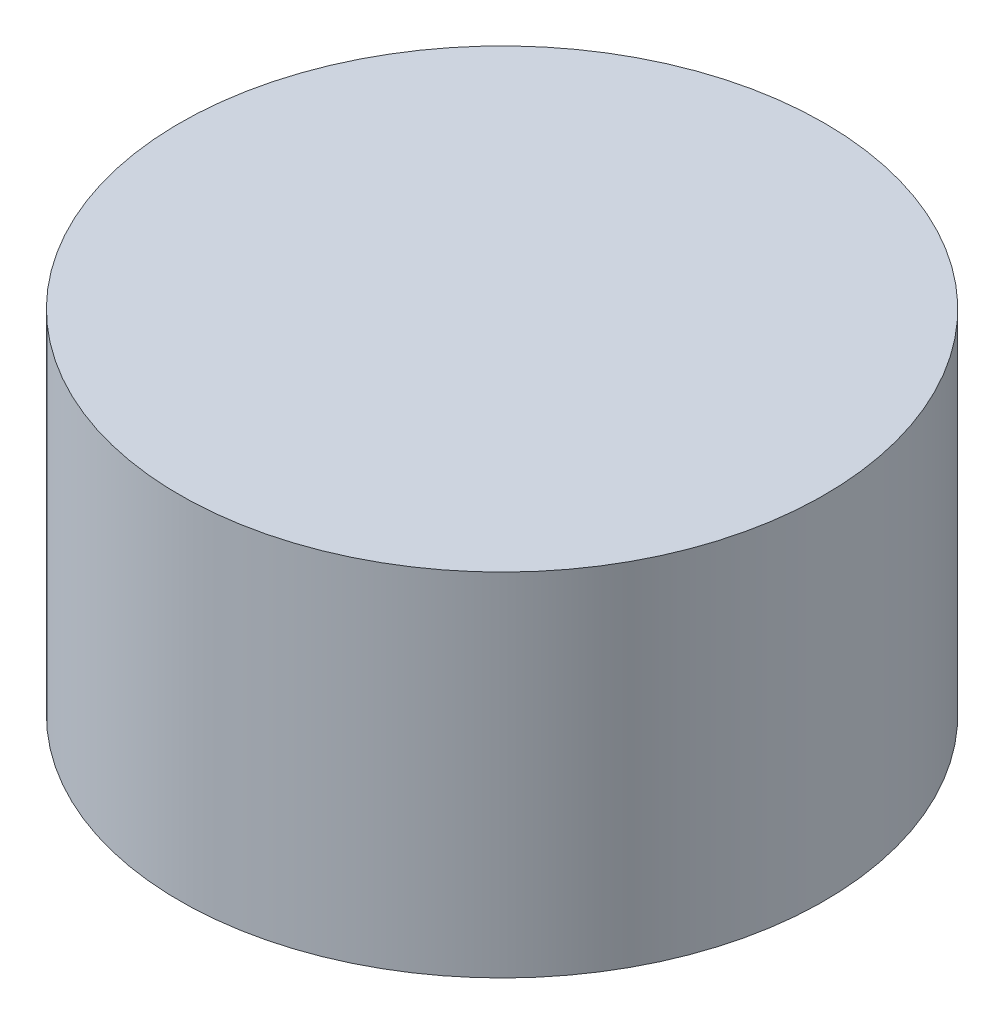
ISO-10303-21;
HEADER;
FILE_DESCRIPTION(('STEP AP214'),'2;1');
FILE_NAME('part.step','',(''),(''),'','','');
FILE_SCHEMA(('AUTOMOTIVE_DESIGN { 1 0 10303 214 1 1 1 1 }'));
ENDSEC;
DATA;
#1=APPLICATION_CONTEXT('core data for automotive mechanical design processes');
#2=APPLICATION_PROTOCOL_DEFINITION('international standard','automotive_design',2000,#1);
#3=PRODUCT_CONTEXT('',#1,'mechanical');
#4=PRODUCT('Part','Part','',(#3));
#5=PRODUCT_RELATED_PRODUCT_CATEGORY('part','',(#4));
#6=PRODUCT_DEFINITION_FORMATION('','',#4);
#7=PRODUCT_DEFINITION_CONTEXT('part definition',#1,'design');
#8=PRODUCT_DEFINITION('design','',#6,#7);
#9=PRODUCT_DEFINITION_SHAPE('','',#8);
#10=(LENGTH_UNIT() NAMED_UNIT(*) SI_UNIT(.MILLI.,.METRE.));
#11=(NAMED_UNIT(*) PLANE_ANGLE_UNIT() SI_UNIT($,.RADIAN.));
#12=(NAMED_UNIT(*) SI_UNIT($,.STERADIAN.) SOLID_ANGLE_UNIT());
#13=UNCERTAINTY_MEASURE_WITH_UNIT(LENGTH_MEASURE(1.E-05),#10,'distance_accuracy_value','');
#14=(GEOMETRIC_REPRESENTATION_CONTEXT(3) GLOBAL_UNCERTAINTY_ASSIGNED_CONTEXT((#13)) GLOBAL_UNIT_ASSIGNED_CONTEXT((#10,
#11,#12)) REPRESENTATION_CONTEXT('',''));
#15=CARTESIAN_POINT('',(0.,0.,0.));
#16=DIRECTION('',(0.,0.,1.));
#17=DIRECTION('',(1.,0.,0.));
#18=AXIS2_PLACEMENT_3D('',#15,#16,#17);
#19=CARTESIAN_POINT('',(-35.2046310456011,28.6759487179487,0.));
#20=DIRECTION('',(0.,-1.,0.));
#21=DIRECTION('',(0.,0.,-1.));
#22=AXIS2_PLACEMENT_3D('',#19,#20,#21);
#23=CYLINDRICAL_SURFACE('',#22,55.);
#24=CARTESIAN_POINT('',(-35.2046310456011,88.6759487179487,0.));
#25=DIRECTION('',(0.,-1.,0.));
#26=DIRECTION('',(0.,0.,-1.));
#27=AXIS2_PLACEMENT_3D('',#24,#25,#26);
#28=CIRCLE('',#27,55.);
#29=CARTESIAN_POINT('',(-35.2046310456011,88.6759487179487,-55.));
#30=VERTEX_POINT('',#29);
#31=EDGE_CURVE('E81',#30,#30,#28,.T.);
#32=ORIENTED_EDGE('',*,*,#31,.T.);
#33=EDGE_LOOP('',(#32));
#34=FACE_BOUND('',#33,.T.);
#35=CARTESIAN_POINT('',(-35.2046310456011,28.6759487179487,0.));
#36=DIRECTION('',(0.,-1.,0.));
#37=DIRECTION('',(0.,0.,-1.));
#38=AXIS2_PLACEMENT_3D('',#35,#36,#37);
#39=CIRCLE('',#38,55.);
#40=CARTESIAN_POINT('',(-35.2046310456011,28.6759487179487,-55.));
#41=VERTEX_POINT('',#40);
#42=EDGE_CURVE('E104',#41,#41,#39,.T.);
#43=ORIENTED_EDGE('',*,*,#42,.F.);
#44=EDGE_LOOP('',(#43));
#45=FACE_BOUND('',#44,.T.);
#46=CARTESIAN_POINT('',(-35.2046310456011,58.1759487179487,0.));
#47=DIRECTION('',(0.,1.,0.));
#48=DIRECTION('',(0.,0.,1.));
#49=AXIS2_PLACEMENT_3D('',#46,#47,#48);
#50=CIRCLE('',#49,55.);
#51=CARTESIAN_POINT('',(-89.6638450813409,58.1759487179487,-7.69376413789013));
#52=VERTEX_POINT('',#51);
#53=CARTESIAN_POINT('',(-90.1891174747071,58.1759487179487,1.30623586210987));
#54=VERTEX_POINT('',#53);
#55=EDGE_CURVE('E92',#52,#54,#50,.T.);
#56=ORIENTED_EDGE('',*,*,#55,.F.);
#57=DIRECTION('',(0.,-1.,0.));
#58=VECTOR('',#57,1.);
#59=CARTESIAN_POINT('',(-89.6638450813409,28.6759487179487,-7.69376413789013));
#60=LINE('',#59,#58);
#61=CARTESIAN_POINT('',(-89.6638450813409,67.1759487179487,-7.69376413789013));
#62=VERTEX_POINT('',#61);
#63=EDGE_CURVE('E112',#62,#52,#60,.T.);
#64=ORIENTED_EDGE('',*,*,#63,.F.);
#65=CARTESIAN_POINT('',(-35.2046310456011,67.1759487179487,0.));
#66=DIRECTION('',(0.,-1.,0.));
#67=DIRECTION('',(0.,0.,-1.));
#68=AXIS2_PLACEMENT_3D('',#65,#66,#67);
#69=CIRCLE('',#68,55.);
#70=CARTESIAN_POINT('',(-90.1891174747071,67.1759487179487,1.30623586210987));
#71=VERTEX_POINT('',#70);
#72=EDGE_CURVE('E116',#71,#62,#69,.T.);
#73=ORIENTED_EDGE('',*,*,#72,.F.);
#74=DIRECTION('',(0.,-1.,0.));
#75=VECTOR('',#74,1.);
#76=CARTESIAN_POINT('',(-90.1891174747071,28.6759487179487,1.30623586210987));
#77=LINE('',#76,#75);
#78=EDGE_CURVE('E117',#54,#71,#77,.F.);
#79=ORIENTED_EDGE('',*,*,#78,.F.);
#80=EDGE_LOOP('',(#56,#64,#73,#79));
#81=FACE_BOUND('',#80,.T.);
#82=ADVANCED_FACE('F41',(#34,#45,#81),#23,.T.);
#83=CARTESIAN_POINT('',(-35.2046310456011,83.6759487179487,0.));
#84=DIRECTION('',(0.,-1.,0.));
#85=DIRECTION('',(0.,0.,-1.));
#86=AXIS2_PLACEMENT_3D('',#83,#84,#85);
#87=CYLINDRICAL_SURFACE('',#86,50.);
#88=CARTESIAN_POINT('',(-35.2046310456011,28.6759487179487,0.));
#89=DIRECTION('',(0.,-1.,0.));
#90=DIRECTION('',(0.,0.,-1.));
#91=AXIS2_PLACEMENT_3D('',#88,#89,#90);
#92=CIRCLE('',#91,50.);
#93=CARTESIAN_POINT('',(-35.2046310456011,28.6759487179487,-50.));
#94=VERTEX_POINT('',#93);
#95=EDGE_CURVE('E108',#94,#94,#92,.T.);
#96=ORIENTED_EDGE('',*,*,#95,.T.);
#97=EDGE_LOOP('',(#96));
#98=FACE_BOUND('',#97,.T.);
#99=CARTESIAN_POINT('',(-35.2046310456011,83.6759487179487,0.));
#100=DIRECTION('',(0.,-1.,0.));
#101=DIRECTION('',(0.,0.,-1.));
#102=AXIS2_PLACEMENT_3D('',#99,#100,#101);
#103=CIRCLE('',#102,50.);
#104=CARTESIAN_POINT('',(-35.2046310456011,83.6759487179487,-50.));
#105=VERTEX_POINT('',#104);
#106=EDGE_CURVE('E110',#105,#105,#103,.T.);
#107=ORIENTED_EDGE('',*,*,#106,.F.);
#108=EDGE_LOOP('',(#107));
#109=FACE_BOUND('',#108,.T.);
#110=CARTESIAN_POINT('',(-35.2046310456011,58.1759487179487,0.));
#111=DIRECTION('',(0.,1.,0.));
#112=DIRECTION('',(0.,0.,1.));
#113=AXIS2_PLACEMENT_3D('',#110,#111,#112);
#114=CIRCLE('',#113,50.);
#115=CARTESIAN_POINT('',(-85.1875656120363,58.1759487179487,1.30623586210987));
#116=VERTEX_POINT('',#115);
#117=CARTESIAN_POINT('',(-84.6091449425166,58.1759487179487,-7.69376413789013));
#118=VERTEX_POINT('',#117);
#119=EDGE_CURVE('E11',#116,#118,#114,.F.);
#120=ORIENTED_EDGE('',*,*,#119,.F.);
#121=DIRECTION('',(0.,-1.,0.));
#122=VECTOR('',#121,1.);
#123=CARTESIAN_POINT('',(-85.1875656120363,83.6759487179487,1.30623586210987));
#124=LINE('',#123,#122);
#125=CARTESIAN_POINT('',(-85.1875656120363,67.1759487179487,1.30623586210987));
#126=VERTEX_POINT('',#125);
#127=EDGE_CURVE('E76',#126,#116,#124,.T.);
#128=ORIENTED_EDGE('',*,*,#127,.F.);
#129=CARTESIAN_POINT('',(-35.2046310456011,67.1759487179487,0.));
#130=DIRECTION('',(0.,-1.,0.));
#131=DIRECTION('',(0.,0.,-1.));
#132=AXIS2_PLACEMENT_3D('',#129,#130,#131);
#133=CIRCLE('',#132,50.);
#134=CARTESIAN_POINT('',(-84.6091449425166,67.1759487179487,-7.69376413789013));
#135=VERTEX_POINT('',#134);
#136=EDGE_CURVE('E84',#135,#126,#133,.F.);
#137=ORIENTED_EDGE('',*,*,#136,.F.);
#138=DIRECTION('',(0.,-1.,0.));
#139=VECTOR('',#138,1.);
#140=CARTESIAN_POINT('',(-84.6091449425166,83.6759487179487,-7.69376413789013));
#141=LINE('',#140,#139);
#142=EDGE_CURVE('E47',#118,#135,#141,.F.);
#143=ORIENTED_EDGE('',*,*,#142,.F.);
#144=EDGE_LOOP('',(#120,#128,#137,#143));
#145=FACE_BOUND('',#144,.T.);
#146=ADVANCED_FACE('F98',(#98,#109,#145),#87,.F.);
#147=CARTESIAN_POINT('',(-35.2046310456011,88.6759487179487,0.));
#148=DIRECTION('',(0.,-1.,0.));
#149=DIRECTION('',(0.,0.,-1.));
#150=AXIS2_PLACEMENT_3D('',#147,#148,#149);
#151=PLANE('',#150);
#152=ORIENTED_EDGE('',*,*,#31,.F.);
#153=EDGE_LOOP('',(#152));
#154=FACE_BOUND('',#153,.T.);
#155=ADVANCED_FACE('F43',(#154),#151,.F.);
#156=CARTESIAN_POINT('',(-90.2046310456011,28.6759487179487,0.));
#157=DIRECTION('',(0.,1.,0.));
#158=DIRECTION('',(0.,0.,1.));
#159=AXIS2_PLACEMENT_3D('',#156,#157,#158);
#160=PLANE('',#159);
#161=CARTESIAN_POINT('',(-35.2046310456011,28.6759487179487,52.5095979864125));
#162=DIRECTION('',(0.,-1.,0.));
#163=DIRECTION('',(0.,0.,-1.));
#164=AXIS2_PLACEMENT_3D('',#161,#162,#163);
#165=CIRCLE('',#164,1.99812776522136);
#166=CARTESIAN_POINT('',(-35.2046310456011,28.6759487179487,50.5114702211911));
#167=VERTEX_POINT('',#166);
#168=EDGE_CURVE('E141',#167,#167,#165,.T.);
#169=ORIENTED_EDGE('',*,*,#168,.F.);
#170=EDGE_LOOP('',(#169));
#171=FACE_BOUND('',#170,.T.);
#172=CARTESIAN_POINT('',(17.3049669408114,28.6759487179487,-1.80411241501588E-13));
#173=DIRECTION('',(0.,-1.,0.));
#174=DIRECTION('',(0.,0.,-1.));
#175=AXIS2_PLACEMENT_3D('',#172,#173,#174);
#176=CIRCLE('',#175,1.99812776522135);
#177=CARTESIAN_POINT('',(17.3049669408114,28.6759487179487,-1.99812776522154));
#178=VERTEX_POINT('',#177);
#179=EDGE_CURVE('E136',#178,#178,#176,.T.);
#180=ORIENTED_EDGE('',*,*,#179,.F.);
#181=EDGE_LOOP('',(#180));
#182=FACE_BOUND('',#181,.T.);
#183=CARTESIAN_POINT('',(-35.2046310456015,28.6759487179487,-52.5095979864125));
#184=DIRECTION('',(0.,-1.,0.));
#185=DIRECTION('',(0.,0.,-1.));
#186=AXIS2_PLACEMENT_3D('',#183,#184,#185);
#187=CIRCLE('',#186,1.99812776522136);
#188=CARTESIAN_POINT('',(-35.2046310456015,28.6759487179487,-54.5077257516339));
#189=VERTEX_POINT('',#188);
#190=EDGE_CURVE('E133',#189,#189,#187,.T.);
#191=ORIENTED_EDGE('',*,*,#190,.F.);
#192=EDGE_LOOP('',(#191));
#193=FACE_BOUND('',#192,.T.);
#194=CARTESIAN_POINT('',(-87.7142290320136,28.6759487179487,5.41233724504764E-13));
#195=DIRECTION('',(0.,-1.,0.));
#196=DIRECTION('',(0.,0.,-1.));
#197=AXIS2_PLACEMENT_3D('',#194,#195,#196);
#198=CIRCLE('',#197,1.99812776522135);
#199=CARTESIAN_POINT('',(-87.7142290320136,28.6759487179487,-1.99812776522081));
#200=VERTEX_POINT('',#199);
#201=EDGE_CURVE('E129',#200,#200,#198,.T.);
#202=ORIENTED_EDGE('',*,*,#201,.F.);
#203=EDGE_LOOP('',(#202));
#204=FACE_BOUND('',#203,.T.);
#205=ORIENTED_EDGE('',*,*,#95,.F.);
#206=EDGE_LOOP('',(#205));
#207=FACE_BOUND('',#206,.T.);
#208=ORIENTED_EDGE('',*,*,#42,.T.);
#209=EDGE_LOOP('',(#208));
#210=FACE_BOUND('',#209,.T.);
#211=ADVANCED_FACE('F158',(#171,#182,#193,#204,#207,#210),#160,.F.);
#212=CARTESIAN_POINT('',(-35.2046310456011,83.6759487179487,0.));
#213=DIRECTION('',(0.,-1.,0.));
#214=DIRECTION('',(0.,0.,-1.));
#215=AXIS2_PLACEMENT_3D('',#212,#213,#214);
#216=PLANE('',#215);
#217=ORIENTED_EDGE('',*,*,#106,.T.);
#218=EDGE_LOOP('',(#217));
#219=FACE_BOUND('',#218,.T.);
#220=ADVANCED_FACE('F163',(#219),#216,.T.);
#221=CARTESIAN_POINT('',(-40.,58.1759487179487,-3.19376413789013));
#222=DIRECTION('',(0.,1.,0.));
#223=DIRECTION('',(0.,0.,1.));
#224=AXIS2_PLACEMENT_3D('',#221,#222,#223);
#225=PLANE('',#224);
#226=ORIENTED_EDGE('',*,*,#55,.T.);
#227=DIRECTION('',(-1.,0.,0.));
#228=VECTOR('',#227,1.);
#229=CARTESIAN_POINT('',(-40.,58.1759487179487,1.30623586210987));
#230=LINE('',#229,#228);
#231=EDGE_CURVE('E57',#116,#54,#230,.T.);
#232=ORIENTED_EDGE('',*,*,#231,.F.);
#233=ORIENTED_EDGE('',*,*,#119,.T.);
#234=DIRECTION('',(-1.,0.,0.));
#235=VECTOR('',#234,1.);
#236=CARTESIAN_POINT('',(-40.,58.1759487179487,-7.69376413789013));
#237=LINE('',#236,#235);
#238=EDGE_CURVE('E119',#118,#52,#237,.T.);
#239=ORIENTED_EDGE('',*,*,#238,.T.);
#240=EDGE_LOOP('',(#226,#232,#233,#239));
#241=FACE_BOUND('',#240,.T.);
#242=ADVANCED_FACE('F87',(#241),#225,.T.);
#243=CARTESIAN_POINT('',(-40.,58.1759487179487,-7.69376413789013));
#244=DIRECTION('',(0.,0.,1.));
#245=DIRECTION('',(1.,0.,0.));
#246=AXIS2_PLACEMENT_3D('',#243,#244,#245);
#247=PLANE('',#246);
#248=ORIENTED_EDGE('',*,*,#63,.T.);
#249=ORIENTED_EDGE('',*,*,#238,.F.);
#250=ORIENTED_EDGE('',*,*,#142,.T.);
#251=DIRECTION('',(-1.,0.,0.));
#252=VECTOR('',#251,1.);
#253=CARTESIAN_POINT('',(-40.,67.1759487179487,-7.69376413789013));
#254=LINE('',#253,#252);
#255=EDGE_CURVE('E125',#135,#62,#254,.T.);
#256=ORIENTED_EDGE('',*,*,#255,.T.);
#257=EDGE_LOOP('',(#248,#249,#250,#256));
#258=FACE_BOUND('',#257,.T.);
#259=ADVANCED_FACE('F179',(#258),#247,.T.);
#260=CARTESIAN_POINT('',(-40.,67.1759487179487,-7.69376413789013));
#261=DIRECTION('',(0.,-1.,0.));
#262=DIRECTION('',(0.,0.,-1.));
#263=AXIS2_PLACEMENT_3D('',#260,#261,#262);
#264=PLANE('',#263);
#265=ORIENTED_EDGE('',*,*,#72,.T.);
#266=ORIENTED_EDGE('',*,*,#255,.F.);
#267=ORIENTED_EDGE('',*,*,#136,.T.);
#268=DIRECTION('',(-1.,0.,0.));
#269=VECTOR('',#268,1.);
#270=CARTESIAN_POINT('',(-40.,67.1759487179487,1.30623586210987));
#271=LINE('',#270,#269);
#272=EDGE_CURVE('E62',#126,#71,#271,.T.);
#273=ORIENTED_EDGE('',*,*,#272,.T.);
#274=EDGE_LOOP('',(#265,#266,#267,#273));
#275=FACE_BOUND('',#274,.T.);
#276=ADVANCED_FACE('F177',(#275),#264,.T.);
#277=CARTESIAN_POINT('',(-40.,67.1759487179487,1.30623586210987));
#278=DIRECTION('',(0.,0.,-1.));
#279=DIRECTION('',(-1.,0.,0.));
#280=AXIS2_PLACEMENT_3D('',#277,#278,#279);
#281=PLANE('',#280);
#282=ORIENTED_EDGE('',*,*,#78,.T.);
#283=ORIENTED_EDGE('',*,*,#272,.F.);
#284=ORIENTED_EDGE('',*,*,#127,.T.);
#285=ORIENTED_EDGE('',*,*,#231,.T.);
#286=EDGE_LOOP('',(#282,#283,#284,#285));
#287=FACE_BOUND('',#286,.T.);
#288=ADVANCED_FACE('F79',(#287),#281,.T.);
#289=CARTESIAN_POINT('',(-87.7142290320136,33.6759487179487,5.41233724504764E-13));
#290=DIRECTION('',(0.,-1.,0.));
#291=DIRECTION('',(0.,0.,-1.));
#292=AXIS2_PLACEMENT_3D('',#289,#290,#291);
#293=CYLINDRICAL_SURFACE('',#292,1.99812776522135);
#294=CARTESIAN_POINT('',(-87.7142290320136,33.6759487179487,5.41233724504764E-13));
#295=DIRECTION('',(0.,-1.,0.));
#296=DIRECTION('',(0.,0.,-1.));
#297=AXIS2_PLACEMENT_3D('',#294,#295,#296);
#298=CIRCLE('',#297,1.99812776522135);
#299=CARTESIAN_POINT('',(-87.7142290320136,33.6759487179487,-1.99812776522081));
#300=VERTEX_POINT('',#299);
#301=EDGE_CURVE('E123',#300,#300,#298,.T.);
#302=ORIENTED_EDGE('',*,*,#301,.F.);
#303=EDGE_LOOP('',(#302));
#304=FACE_BOUND('',#303,.T.);
#305=ORIENTED_EDGE('',*,*,#201,.T.);
#306=EDGE_LOOP('',(#305));
#307=FACE_BOUND('',#306,.T.);
#308=ADVANCED_FACE('F242',(#304,#307),#293,.F.);
#309=CARTESIAN_POINT('',(-87.7142290320136,33.6759487179487,5.41233724504764E-13));
#310=DIRECTION('',(0.,-1.,0.));
#311=DIRECTION('',(0.,0.,-1.));
#312=AXIS2_PLACEMENT_3D('',#309,#310,#311);
#313=PLANE('',#312);
#314=ORIENTED_EDGE('',*,*,#301,.T.);
#315=EDGE_LOOP('',(#314));
#316=FACE_BOUND('',#315,.T.);
#317=ADVANCED_FACE('F254',(#316),#313,.T.);
#318=CARTESIAN_POINT('',(-35.2046310456015,33.6759487179487,-52.5095979864125));
#319=DIRECTION('',(0.,-1.,0.));
#320=DIRECTION('',(0.,0.,-1.));
#321=AXIS2_PLACEMENT_3D('',#318,#319,#320);
#322=CYLINDRICAL_SURFACE('',#321,1.99812776522136);
#323=CARTESIAN_POINT('',(-35.2046310456015,33.6759487179487,-52.5095979864125));
#324=DIRECTION('',(0.,-1.,0.));
#325=DIRECTION('',(0.,0.,-1.));
#326=AXIS2_PLACEMENT_3D('',#323,#324,#325);
#327=CIRCLE('',#326,1.99812776522136);
#328=CARTESIAN_POINT('',(-35.2046310456015,33.6759487179487,-54.5077257516339));
#329=VERTEX_POINT('',#328);
#330=EDGE_CURVE('E131',#329,#329,#327,.T.);
#331=ORIENTED_EDGE('',*,*,#330,.F.);
#332=EDGE_LOOP('',(#331));
#333=FACE_BOUND('',#332,.T.);
#334=ORIENTED_EDGE('',*,*,#190,.T.);
#335=EDGE_LOOP('',(#334));
#336=FACE_BOUND('',#335,.T.);
#337=ADVANCED_FACE('F264',(#333,#336),#322,.F.);
#338=CARTESIAN_POINT('',(-35.2046310456015,33.6759487179487,-52.5095979864125));
#339=DIRECTION('',(0.,-1.,0.));
#340=DIRECTION('',(0.,0.,-1.));
#341=AXIS2_PLACEMENT_3D('',#338,#339,#340);
#342=PLANE('',#341);
#343=ORIENTED_EDGE('',*,*,#330,.T.);
#344=EDGE_LOOP('',(#343));
#345=FACE_BOUND('',#344,.T.);
#346=ADVANCED_FACE('F271',(#345),#342,.T.);
#347=CARTESIAN_POINT('',(17.3049669408114,33.6759487179487,-1.80411241501588E-13));
#348=DIRECTION('',(0.,-1.,0.));
#349=DIRECTION('',(0.,0.,-1.));
#350=AXIS2_PLACEMENT_3D('',#347,#348,#349);
#351=CYLINDRICAL_SURFACE('',#350,1.99812776522135);
#352=CARTESIAN_POINT('',(17.3049669408114,33.6759487179487,-1.80411241501588E-13));
#353=DIRECTION('',(0.,-1.,0.));
#354=DIRECTION('',(0.,0.,-1.));
#355=AXIS2_PLACEMENT_3D('',#352,#353,#354);
#356=CIRCLE('',#355,1.99812776522135);
#357=CARTESIAN_POINT('',(17.3049669408114,33.6759487179487,-1.99812776522154));
#358=VERTEX_POINT('',#357);
#359=EDGE_CURVE('E140',#358,#358,#356,.T.);
#360=ORIENTED_EDGE('',*,*,#359,.F.);
#361=EDGE_LOOP('',(#360));
#362=FACE_BOUND('',#361,.T.);
#363=ORIENTED_EDGE('',*,*,#179,.T.);
#364=EDGE_LOOP('',(#363));
#365=FACE_BOUND('',#364,.T.);
#366=ADVANCED_FACE('F284',(#362,#365),#351,.F.);
#367=CARTESIAN_POINT('',(17.3049669408114,33.6759487179487,-1.80411241501588E-13));
#368=DIRECTION('',(0.,-1.,0.));
#369=DIRECTION('',(0.,0.,-1.));
#370=AXIS2_PLACEMENT_3D('',#367,#368,#369);
#371=PLANE('',#370);
#372=ORIENTED_EDGE('',*,*,#359,.T.);
#373=EDGE_LOOP('',(#372));
#374=FACE_BOUND('',#373,.T.);
#375=ADVANCED_FACE('F153',(#374),#371,.T.);
#376=CARTESIAN_POINT('',(-35.2046310456011,33.6759487179487,52.5095979864125));
#377=DIRECTION('',(0.,-1.,0.));
#378=DIRECTION('',(0.,0.,-1.));
#379=AXIS2_PLACEMENT_3D('',#376,#377,#378);
#380=CYLINDRICAL_SURFACE('',#379,1.99812776522136);
#381=CARTESIAN_POINT('',(-35.2046310456011,33.6759487179487,52.5095979864125));
#382=DIRECTION('',(0.,-1.,0.));
#383=DIRECTION('',(0.,0.,-1.));
#384=AXIS2_PLACEMENT_3D('',#381,#382,#383);
#385=CIRCLE('',#384,1.99812776522136);
#386=CARTESIAN_POINT('',(-35.2046310456011,33.6759487179487,50.5114702211911));
#387=VERTEX_POINT('',#386);
#388=EDGE_CURVE('E93',#387,#387,#385,.T.);
#389=ORIENTED_EDGE('',*,*,#388,.F.);
#390=EDGE_LOOP('',(#389));
#391=FACE_BOUND('',#390,.T.);
#392=ORIENTED_EDGE('',*,*,#168,.T.);
#393=EDGE_LOOP('',(#392));
#394=FACE_BOUND('',#393,.T.);
#395=ADVANCED_FACE('F151',(#391,#394),#380,.F.);
#396=CARTESIAN_POINT('',(-35.2046310456011,33.6759487179487,52.5095979864125));
#397=DIRECTION('',(0.,-1.,0.));
#398=DIRECTION('',(0.,0.,-1.));
#399=AXIS2_PLACEMENT_3D('',#396,#397,#398);
#400=PLANE('',#399);
#401=ORIENTED_EDGE('',*,*,#388,.T.);
#402=EDGE_LOOP('',(#401));
#403=FACE_BOUND('',#402,.T.);
#404=ADVANCED_FACE('F146',(#403),#400,.T.);
#405=CLOSED_SHELL('',(#82,#146,#155,#211,#220,#242,#259,#276,#288,#308,#317,#337,#346,#366,#375,
#395,#404));
#406=MANIFOLD_SOLID_BREP('B2',#405);
#407=ADVANCED_BREP_SHAPE_REPRESENTATION('',(#18,#406),#14);
#408=SHAPE_DEFINITION_REPRESENTATION(#9,#407);
ENDSEC;
END-ISO-10303-21;
